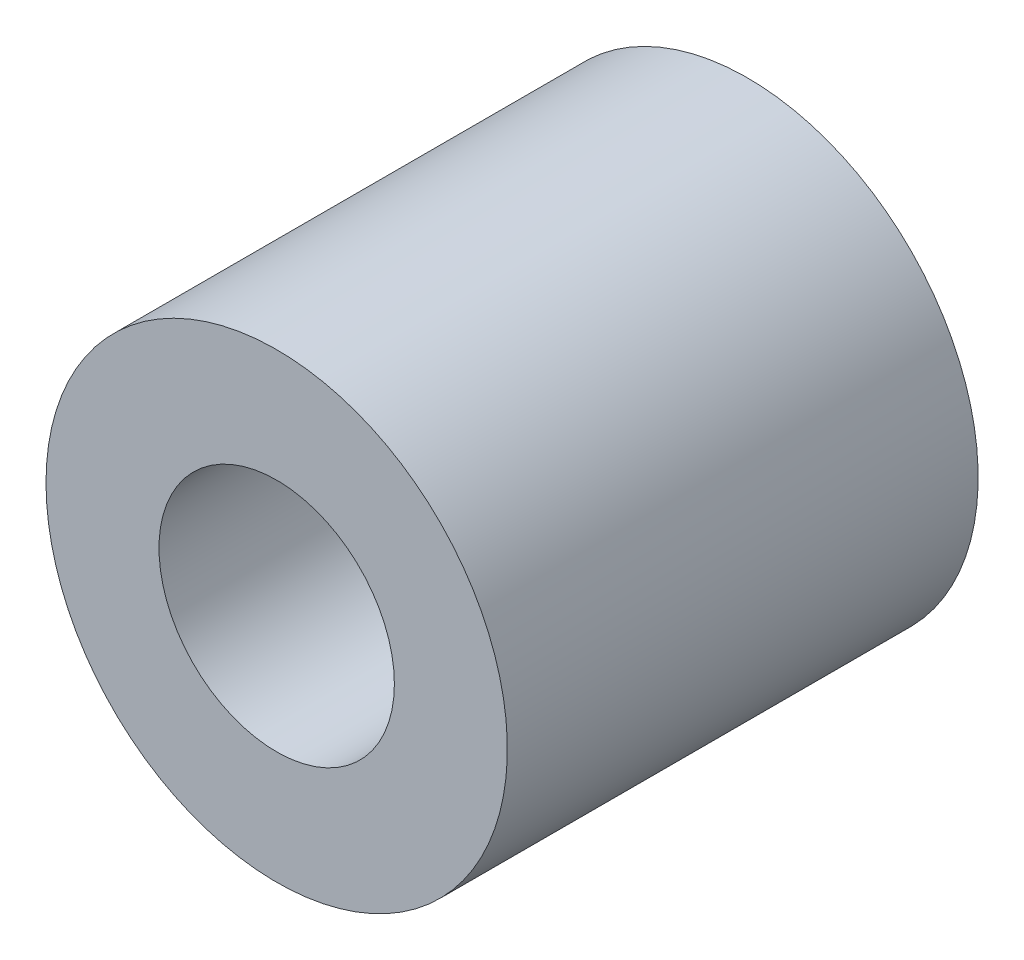
ISO-10303-21;
HEADER;
FILE_DESCRIPTION(('STEP AP214'),'2;1');
FILE_NAME('part.step','',(''),(''),'','','');
FILE_SCHEMA(('AUTOMOTIVE_DESIGN { 1 0 10303 214 1 1 1 1 }'));
ENDSEC;
DATA;
#1=APPLICATION_CONTEXT('core data for automotive mechanical design processes');
#2=APPLICATION_PROTOCOL_DEFINITION('international standard','automotive_design',2000,#1);
#3=PRODUCT_CONTEXT('',#1,'mechanical');
#4=PRODUCT('Part','Part','',(#3));
#5=PRODUCT_RELATED_PRODUCT_CATEGORY('part','',(#4));
#6=PRODUCT_DEFINITION_FORMATION('','',#4);
#7=PRODUCT_DEFINITION_CONTEXT('part definition',#1,'design');
#8=PRODUCT_DEFINITION('design','',#6,#7);
#9=PRODUCT_DEFINITION_SHAPE('','',#8);
#10=(LENGTH_UNIT() NAMED_UNIT(*) SI_UNIT(.MILLI.,.METRE.));
#11=(NAMED_UNIT(*) PLANE_ANGLE_UNIT() SI_UNIT($,.RADIAN.));
#12=(NAMED_UNIT(*) SI_UNIT($,.STERADIAN.) SOLID_ANGLE_UNIT());
#13=UNCERTAINTY_MEASURE_WITH_UNIT(LENGTH_MEASURE(1.E-05),#10,'distance_accuracy_value','');
#14=(GEOMETRIC_REPRESENTATION_CONTEXT(3) GLOBAL_UNCERTAINTY_ASSIGNED_CONTEXT((#13)) GLOBAL_UNIT_ASSIGNED_CONTEXT((#10,
#11,#12)) REPRESENTATION_CONTEXT('',''));
#15=CARTESIAN_POINT('',(0.,0.,0.));
#16=DIRECTION('',(0.,0.,1.));
#17=DIRECTION('',(1.,0.,0.));
#18=AXIS2_PLACEMENT_3D('',#15,#16,#17);
#19=CARTESIAN_POINT('',(0.,0.,-1.55));
#20=DIRECTION('',(0.,0.,1.));
#21=DIRECTION('',(-1.,0.,0.));
#22=AXIS2_PLACEMENT_3D('',#19,#20,#21);
#23=CYLINDRICAL_SURFACE('',#22,2.5);
#24=CARTESIAN_POINT('',(0.,0.,0.));
#25=DIRECTION('',(0.,0.,1.));
#26=DIRECTION('',(-1.,0.,0.));
#27=AXIS2_PLACEMENT_3D('',#24,#25,#26);
#28=CIRCLE('',#27,2.5);
#29=CARTESIAN_POINT('',(2.5,0.,0.));
#30=VERTEX_POINT('',#29);
#31=EDGE_CURVE('E63',#30,#30,#28,.T.);
#32=ORIENTED_EDGE('',*,*,#31,.F.);
#33=DIRECTION('',(0.,0.,1.));
#34=VECTOR('',#33,1.);
#35=CARTESIAN_POINT('',(2.5,0.,-1.55));
#36=LINE('',#35,#34);
#37=CARTESIAN_POINT('',(2.5,0.,10.));
#38=VERTEX_POINT('',#37);
#39=EDGE_CURVE('E11',#30,#38,#36,.T.);
#40=ORIENTED_EDGE('',*,*,#39,.T.);
#41=CARTESIAN_POINT('',(0.,0.,10.));
#42=DIRECTION('',(0.,0.,1.));
#43=DIRECTION('',(-1.,0.,0.));
#44=AXIS2_PLACEMENT_3D('',#41,#42,#43);
#45=CIRCLE('',#44,2.5);
#46=EDGE_CURVE('E26',#38,#38,#45,.T.);
#47=ORIENTED_EDGE('',*,*,#46,.T.);
#48=ORIENTED_EDGE('',*,*,#39,.F.);
#49=EDGE_LOOP('',(#32,#40,#47,#48));
#50=FACE_BOUND('',#49,.T.);
#51=ADVANCED_FACE('F17',(#50),#23,.F.);
#52=CARTESIAN_POINT('',(0.,0.,10.));
#53=DIRECTION('',(0.,0.,1.));
#54=DIRECTION('',(1.,0.,0.));
#55=AXIS2_PLACEMENT_3D('',#52,#53,#54);
#56=PLANE('',#55);
#57=ORIENTED_EDGE('',*,*,#46,.F.);
#58=EDGE_LOOP('',(#57));
#59=FACE_BOUND('',#58,.T.);
#60=CARTESIAN_POINT('',(0.,0.,10.));
#61=DIRECTION('',(0.,0.,1.));
#62=DIRECTION('',(1.,0.,0.));
#63=AXIS2_PLACEMENT_3D('',#60,#61,#62);
#64=CIRCLE('',#63,4.9);
#65=CARTESIAN_POINT('',(-4.9,0.,10.));
#66=VERTEX_POINT('',#65);
#67=EDGE_CURVE('E20',#66,#66,#64,.T.);
#68=ORIENTED_EDGE('',*,*,#67,.T.);
#69=EDGE_LOOP('',(#68));
#70=FACE_BOUND('',#69,.T.);
#71=ADVANCED_FACE('F84',(#59,#70),#56,.T.);
#72=CARTESIAN_POINT('',(0.,0.,0.));
#73=DIRECTION('',(0.,0.,1.));
#74=DIRECTION('',(1.,0.,0.));
#75=AXIS2_PLACEMENT_3D('',#72,#73,#74);
#76=CYLINDRICAL_SURFACE('',#75,4.9);
#77=ORIENTED_EDGE('',*,*,#67,.F.);
#78=DIRECTION('',(0.,0.,-1.));
#79=VECTOR('',#78,1.);
#80=CARTESIAN_POINT('',(-4.9,0.,0.));
#81=LINE('',#80,#79);
#82=CARTESIAN_POINT('',(-4.9,0.,0.));
#83=VERTEX_POINT('',#82);
#84=EDGE_CURVE('E46',#66,#83,#81,.T.);
#85=ORIENTED_EDGE('',*,*,#84,.T.);
#86=CARTESIAN_POINT('',(0.,0.,0.));
#87=DIRECTION('',(0.,0.,1.));
#88=DIRECTION('',(1.,0.,0.));
#89=AXIS2_PLACEMENT_3D('',#86,#87,#88);
#90=CIRCLE('',#89,4.9);
#91=EDGE_CURVE('E55',#83,#83,#90,.T.);
#92=ORIENTED_EDGE('',*,*,#91,.T.);
#93=ORIENTED_EDGE('',*,*,#84,.F.);
#94=EDGE_LOOP('',(#77,#85,#92,#93));
#95=FACE_BOUND('',#94,.T.);
#96=ADVANCED_FACE('F53',(#95),#76,.T.);
#97=CARTESIAN_POINT('',(0.,0.,0.));
#98=DIRECTION('',(0.,0.,1.));
#99=DIRECTION('',(1.,0.,0.));
#100=AXIS2_PLACEMENT_3D('',#97,#98,#99);
#101=PLANE('',#100);
#102=ORIENTED_EDGE('',*,*,#31,.T.);
#103=EDGE_LOOP('',(#102));
#104=FACE_BOUND('',#103,.T.);
#105=ORIENTED_EDGE('',*,*,#91,.F.);
#106=EDGE_LOOP('',(#105));
#107=FACE_BOUND('',#106,.T.);
#108=ADVANCED_FACE('F98',(#104,#107),#101,.F.);
#109=CLOSED_SHELL('',(#51,#71,#96,#108));
#110=MANIFOLD_SOLID_BREP('B1',#109);
#111=ADVANCED_BREP_SHAPE_REPRESENTATION('',(#18,#110),#14);
#112=SHAPE_DEFINITION_REPRESENTATION(#9,#111);
ENDSEC;
END-ISO-10303-21;
